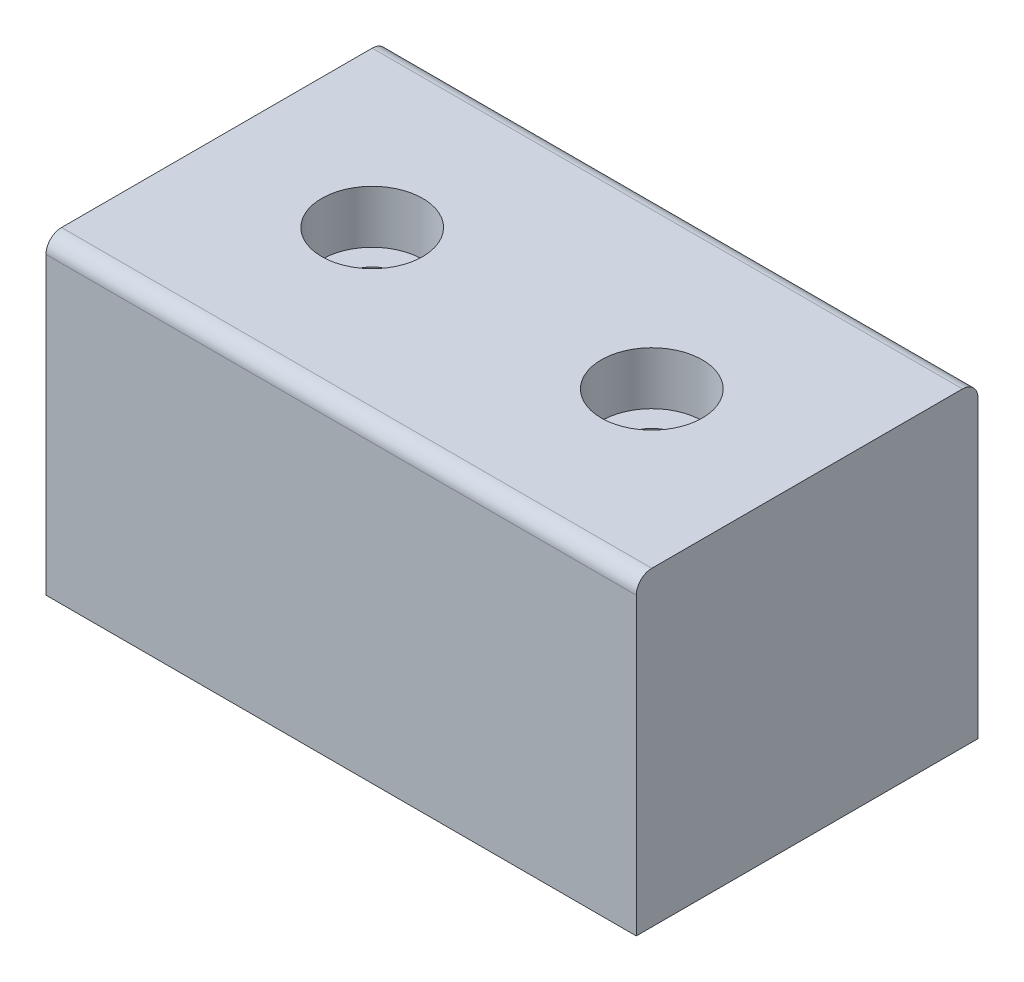
ISO-10303-21;
HEADER;
FILE_DESCRIPTION(('STEP AP214'),'2;1');
FILE_NAME('part.step','',(''),(''),'','','');
FILE_SCHEMA(('AUTOMOTIVE_DESIGN { 1 0 10303 214 1 1 1 1 }'));
ENDSEC;
DATA;
#1=APPLICATION_CONTEXT('core data for automotive mechanical design processes');
#2=APPLICATION_PROTOCOL_DEFINITION('international standard','automotive_design',2000,#1);
#3=PRODUCT_CONTEXT('',#1,'mechanical');
#4=PRODUCT('Part','Part','',(#3));
#5=PRODUCT_RELATED_PRODUCT_CATEGORY('part','',(#4));
#6=PRODUCT_DEFINITION_FORMATION('','',#4);
#7=PRODUCT_DEFINITION_CONTEXT('part definition',#1,'design');
#8=PRODUCT_DEFINITION('design','',#6,#7);
#9=PRODUCT_DEFINITION_SHAPE('','',#8);
#10=(LENGTH_UNIT() NAMED_UNIT(*) SI_UNIT(.MILLI.,.METRE.));
#11=(NAMED_UNIT(*) PLANE_ANGLE_UNIT() SI_UNIT($,.RADIAN.));
#12=(NAMED_UNIT(*) SI_UNIT($,.STERADIAN.) SOLID_ANGLE_UNIT());
#13=UNCERTAINTY_MEASURE_WITH_UNIT(LENGTH_MEASURE(1.E-05),#10,'distance_accuracy_value','');
#14=(GEOMETRIC_REPRESENTATION_CONTEXT(3) GLOBAL_UNCERTAINTY_ASSIGNED_CONTEXT((#13)) GLOBAL_UNIT_ASSIGNED_CONTEXT((#10,
#11,#12)) REPRESENTATION_CONTEXT('',''));
#15=CARTESIAN_POINT('',(0.,0.,0.));
#16=DIRECTION('',(0.,0.,1.));
#17=DIRECTION('',(1.,0.,0.));
#18=AXIS2_PLACEMENT_3D('',#15,#16,#17);
#19=CARTESIAN_POINT('',(-19.,20.,-11.));
#20=DIRECTION('',(1.,0.,0.));
#21=DIRECTION('',(0.,0.,-1.));
#22=AXIS2_PLACEMENT_3D('',#19,#20,#21);
#23=PLANE('',#22);
#24=DIRECTION('',(0.,0.,1.));
#25=VECTOR('',#24,1.);
#26=CARTESIAN_POINT('',(-19.,20.,-11.));
#27=LINE('',#26,#25);
#28=CARTESIAN_POINT('',(-19.,20.,-10.));
#29=VERTEX_POINT('',#28);
#30=CARTESIAN_POINT('',(-19.,20.,10.));
#31=VERTEX_POINT('',#30);
#32=EDGE_CURVE('E121',#29,#31,#27,.T.);
#33=ORIENTED_EDGE('',*,*,#32,.F.);
#34=CARTESIAN_POINT('',(-19.,19.,-10.));
#35=DIRECTION('',(1.,0.,0.));
#36=DIRECTION('',(0.,0.,-1.));
#37=AXIS2_PLACEMENT_3D('',#34,#35,#36);
#38=CIRCLE('',#37,1.);
#39=CARTESIAN_POINT('',(-19.,19.,-11.));
#40=VERTEX_POINT('',#39);
#41=EDGE_CURVE('E133',#29,#40,#38,.F.);
#42=ORIENTED_EDGE('',*,*,#41,.T.);
#43=DIRECTION('',(0.,-1.,0.));
#44=VECTOR('',#43,1.);
#45=CARTESIAN_POINT('',(-19.,20.,-11.));
#46=LINE('',#45,#44);
#47=CARTESIAN_POINT('',(-19.,0.,-11.));
#48=VERTEX_POINT('',#47);
#49=EDGE_CURVE('E107',#40,#48,#46,.T.);
#50=ORIENTED_EDGE('',*,*,#49,.T.);
#51=DIRECTION('',(0.,0.,1.));
#52=VECTOR('',#51,1.);
#53=CARTESIAN_POINT('',(-19.,0.,-11.));
#54=LINE('',#53,#52);
#55=CARTESIAN_POINT('',(-19.,0.,11.));
#56=VERTEX_POINT('',#55);
#57=EDGE_CURVE('E102',#48,#56,#54,.T.);
#58=ORIENTED_EDGE('',*,*,#57,.T.);
#59=DIRECTION('',(0.,-1.,0.));
#60=VECTOR('',#59,1.);
#61=CARTESIAN_POINT('',(-19.,20.,11.));
#62=LINE('',#61,#60);
#63=CARTESIAN_POINT('',(-19.,19.,11.));
#64=VERTEX_POINT('',#63);
#65=EDGE_CURVE('E86',#64,#56,#62,.T.);
#66=ORIENTED_EDGE('',*,*,#65,.F.);
#67=CARTESIAN_POINT('',(-19.,19.,10.));
#68=DIRECTION('',(1.,0.,0.));
#69=DIRECTION('',(0.,0.,-1.));
#70=AXIS2_PLACEMENT_3D('',#67,#68,#69);
#71=CIRCLE('',#70,1.);
#72=EDGE_CURVE('E131',#64,#31,#71,.F.);
#73=ORIENTED_EDGE('',*,*,#72,.T.);
#74=EDGE_LOOP('',(#33,#42,#50,#58,#66,#73));
#75=FACE_BOUND('',#74,.T.);
#76=ADVANCED_FACE('F33',(#75),#23,.F.);
#77=CARTESIAN_POINT('',(-19.,20.,11.));
#78=DIRECTION('',(0.,0.,-1.));
#79=DIRECTION('',(-1.,0.,0.));
#80=AXIS2_PLACEMENT_3D('',#77,#78,#79);
#81=PLANE('',#80);
#82=DIRECTION('',(0.,-1.,0.));
#83=VECTOR('',#82,1.);
#84=CARTESIAN_POINT('',(19.,20.,11.));
#85=LINE('',#84,#83);
#86=CARTESIAN_POINT('',(19.,19.,11.));
#87=VERTEX_POINT('',#86);
#88=CARTESIAN_POINT('',(19.,0.,11.));
#89=VERTEX_POINT('',#88);
#90=EDGE_CURVE('E96',#87,#89,#85,.T.);
#91=ORIENTED_EDGE('',*,*,#90,.F.);
#92=DIRECTION('',(1.,0.,0.));
#93=VECTOR('',#92,1.);
#94=CARTESIAN_POINT('',(-19.,19.,11.));
#95=LINE('',#94,#93);
#96=EDGE_CURVE('E11',#87,#64,#95,.F.);
#97=ORIENTED_EDGE('',*,*,#96,.T.);
#98=ORIENTED_EDGE('',*,*,#65,.T.);
#99=DIRECTION('',(1.,0.,0.));
#100=VECTOR('',#99,1.);
#101=CARTESIAN_POINT('',(-19.,0.,11.));
#102=LINE('',#101,#100);
#103=EDGE_CURVE('E89',#56,#89,#102,.T.);
#104=ORIENTED_EDGE('',*,*,#103,.T.);
#105=EDGE_LOOP('',(#91,#97,#98,#104));
#106=FACE_BOUND('',#105,.T.);
#107=ADVANCED_FACE('F88',(#106),#81,.F.);
#108=CARTESIAN_POINT('',(19.,20.,-11.));
#109=DIRECTION('',(-1.,0.,0.));
#110=DIRECTION('',(0.,0.,1.));
#111=AXIS2_PLACEMENT_3D('',#108,#109,#110);
#112=PLANE('',#111);
#113=DIRECTION('',(0.,-1.,0.));
#114=VECTOR('',#113,1.);
#115=CARTESIAN_POINT('',(19.,20.,-11.));
#116=LINE('',#115,#114);
#117=CARTESIAN_POINT('',(19.,19.,-11.));
#118=VERTEX_POINT('',#117);
#119=CARTESIAN_POINT('',(19.,0.,-11.));
#120=VERTEX_POINT('',#119);
#121=EDGE_CURVE('E123',#118,#120,#116,.T.);
#122=ORIENTED_EDGE('',*,*,#121,.F.);
#123=CARTESIAN_POINT('',(19.,19.,-10.));
#124=DIRECTION('',(-1.,0.,0.));
#125=DIRECTION('',(0.,0.,1.));
#126=AXIS2_PLACEMENT_3D('',#123,#124,#125);
#127=CIRCLE('',#126,1.);
#128=CARTESIAN_POINT('',(19.,20.,-10.));
#129=VERTEX_POINT('',#128);
#130=EDGE_CURVE('E41',#118,#129,#127,.F.);
#131=ORIENTED_EDGE('',*,*,#130,.T.);
#132=DIRECTION('',(0.,0.,-1.));
#133=VECTOR('',#132,1.);
#134=CARTESIAN_POINT('',(19.,20.,-11.));
#135=LINE('',#134,#133);
#136=CARTESIAN_POINT('',(19.,20.,10.));
#137=VERTEX_POINT('',#136);
#138=EDGE_CURVE('E115',#137,#129,#135,.T.);
#139=ORIENTED_EDGE('',*,*,#138,.F.);
#140=CARTESIAN_POINT('',(19.,19.,10.));
#141=DIRECTION('',(-1.,0.,0.));
#142=DIRECTION('',(0.,0.,1.));
#143=AXIS2_PLACEMENT_3D('',#140,#141,#142);
#144=CIRCLE('',#143,1.);
#145=EDGE_CURVE('E48',#137,#87,#144,.F.);
#146=ORIENTED_EDGE('',*,*,#145,.T.);
#147=ORIENTED_EDGE('',*,*,#90,.T.);
#148=DIRECTION('',(0.,0.,-1.));
#149=VECTOR('',#148,1.);
#150=CARTESIAN_POINT('',(19.,0.,-11.));
#151=LINE('',#150,#149);
#152=EDGE_CURVE('E104',#89,#120,#151,.T.);
#153=ORIENTED_EDGE('',*,*,#152,.T.);
#154=EDGE_LOOP('',(#122,#131,#139,#146,#147,#153));
#155=FACE_BOUND('',#154,.T.);
#156=ADVANCED_FACE('F138',(#155),#112,.F.);
#157=CARTESIAN_POINT('',(-19.,20.,-11.));
#158=DIRECTION('',(0.,0.,1.));
#159=DIRECTION('',(1.,0.,0.));
#160=AXIS2_PLACEMENT_3D('',#157,#158,#159);
#161=PLANE('',#160);
#162=ORIENTED_EDGE('',*,*,#49,.F.);
#163=DIRECTION('',(-1.,0.,0.));
#164=VECTOR('',#163,1.);
#165=CARTESIAN_POINT('',(19.,19.,-11.));
#166=LINE('',#165,#164);
#167=EDGE_CURVE('E56',#40,#118,#166,.F.);
#168=ORIENTED_EDGE('',*,*,#167,.T.);
#169=ORIENTED_EDGE('',*,*,#121,.T.);
#170=DIRECTION('',(-1.,0.,0.));
#171=VECTOR('',#170,1.);
#172=CARTESIAN_POINT('',(-19.,0.,-11.));
#173=LINE('',#172,#171);
#174=EDGE_CURVE('E119',#120,#48,#173,.T.);
#175=ORIENTED_EDGE('',*,*,#174,.T.);
#176=EDGE_LOOP('',(#162,#168,#169,#175));
#177=FACE_BOUND('',#176,.T.);
#178=ADVANCED_FACE('F146',(#177),#161,.F.);
#179=CARTESIAN_POINT('',(0.,20.,0.));
#180=DIRECTION('',(0.,1.,0.));
#181=DIRECTION('',(0.,0.,1.));
#182=AXIS2_PLACEMENT_3D('',#179,#180,#181);
#183=PLANE('',#182);
#184=CARTESIAN_POINT('',(-9.,20.,0.));
#185=DIRECTION('',(0.,1.,0.));
#186=DIRECTION('',(0.,0.,1.));
#187=AXIS2_PLACEMENT_3D('',#184,#185,#186);
#188=CIRCLE('',#187,3.25);
#189=CARTESIAN_POINT('',(-9.,20.,3.25));
#190=VERTEX_POINT('',#189);
#191=EDGE_CURVE('E166',#190,#190,#188,.T.);
#192=ORIENTED_EDGE('',*,*,#191,.F.);
#193=EDGE_LOOP('',(#192));
#194=FACE_BOUND('',#193,.T.);
#195=CARTESIAN_POINT('',(9.,20.,0.));
#196=DIRECTION('',(0.,1.,0.));
#197=DIRECTION('',(0.,0.,1.));
#198=AXIS2_PLACEMENT_3D('',#195,#196,#197);
#199=CIRCLE('',#198,3.25);
#200=CARTESIAN_POINT('',(9.,20.,3.25));
#201=VERTEX_POINT('',#200);
#202=EDGE_CURVE('E154',#201,#201,#199,.T.);
#203=ORIENTED_EDGE('',*,*,#202,.F.);
#204=EDGE_LOOP('',(#203));
#205=FACE_BOUND('',#204,.T.);
#206=ORIENTED_EDGE('',*,*,#138,.T.);
#207=DIRECTION('',(-1.,0.,0.));
#208=VECTOR('',#207,1.);
#209=CARTESIAN_POINT('',(-19.,20.,-10.));
#210=LINE('',#209,#208);
#211=EDGE_CURVE('E128',#129,#29,#210,.T.);
#212=ORIENTED_EDGE('',*,*,#211,.T.);
#213=ORIENTED_EDGE('',*,*,#32,.T.);
#214=DIRECTION('',(1.,0.,0.));
#215=VECTOR('',#214,1.);
#216=CARTESIAN_POINT('',(19.,20.,10.));
#217=LINE('',#216,#215);
#218=EDGE_CURVE('E95',#31,#137,#217,.T.);
#219=ORIENTED_EDGE('',*,*,#218,.T.);
#220=EDGE_LOOP('',(#206,#212,#213,#219));
#221=FACE_BOUND('',#220,.T.);
#222=ADVANCED_FACE('F142',(#194,#205,#221),#183,.T.);
#223=CARTESIAN_POINT('',(0.,0.,0.));
#224=DIRECTION('',(0.,1.,0.));
#225=DIRECTION('',(0.,0.,1.));
#226=AXIS2_PLACEMENT_3D('',#223,#224,#225);
#227=PLANE('',#226);
#228=CARTESIAN_POINT('',(-9.,0.,0.));
#229=DIRECTION('',(0.,1.,0.));
#230=DIRECTION('',(0.,0.,1.));
#231=AXIS2_PLACEMENT_3D('',#228,#229,#230);
#232=CIRCLE('',#231,1.69999999999999);
#233=CARTESIAN_POINT('',(-9.,0.,1.69999999999999));
#234=VERTEX_POINT('',#233);
#235=EDGE_CURVE('E157',#234,#234,#232,.T.);
#236=ORIENTED_EDGE('',*,*,#235,.T.);
#237=EDGE_LOOP('',(#236));
#238=FACE_BOUND('',#237,.T.);
#239=CARTESIAN_POINT('',(9.,0.,0.));
#240=DIRECTION('',(0.,1.,0.));
#241=DIRECTION('',(0.,0.,1.));
#242=AXIS2_PLACEMENT_3D('',#239,#240,#241);
#243=CIRCLE('',#242,1.69999999999999);
#244=CARTESIAN_POINT('',(9.,0.,1.69999999999999));
#245=VERTEX_POINT('',#244);
#246=EDGE_CURVE('E109',#245,#245,#243,.T.);
#247=ORIENTED_EDGE('',*,*,#246,.T.);
#248=EDGE_LOOP('',(#247));
#249=FACE_BOUND('',#248,.T.);
#250=ORIENTED_EDGE('',*,*,#57,.F.);
#251=ORIENTED_EDGE('',*,*,#174,.F.);
#252=ORIENTED_EDGE('',*,*,#152,.F.);
#253=ORIENTED_EDGE('',*,*,#103,.F.);
#254=EDGE_LOOP('',(#250,#251,#252,#253));
#255=FACE_BOUND('',#254,.T.);
#256=ADVANCED_FACE('F100',(#238,#249,#255),#227,.F.);
#257=CARTESIAN_POINT('',(9.,20.,0.));
#258=DIRECTION('',(0.,1.,0.));
#259=DIRECTION('',(0.,0.,1.));
#260=AXIS2_PLACEMENT_3D('',#257,#258,#259);
#261=CYLINDRICAL_SURFACE('',#260,1.7);
#262=ORIENTED_EDGE('',*,*,#246,.F.);
#263=EDGE_LOOP('',(#262));
#264=FACE_BOUND('',#263,.T.);
#265=CARTESIAN_POINT('',(9.,16.6,0.));
#266=DIRECTION('',(0.,1.,0.));
#267=DIRECTION('',(0.,0.,1.));
#268=AXIS2_PLACEMENT_3D('',#265,#266,#267);
#269=CIRCLE('',#268,1.7);
#270=CARTESIAN_POINT('',(9.,16.6,1.7));
#271=VERTEX_POINT('',#270);
#272=EDGE_CURVE('E112',#271,#271,#269,.T.);
#273=ORIENTED_EDGE('',*,*,#272,.T.);
#274=EDGE_LOOP('',(#273));
#275=FACE_BOUND('',#274,.T.);
#276=ADVANCED_FACE('F190',(#264,#275),#261,.F.);
#277=CARTESIAN_POINT('',(10.7,16.6,0.));
#278=DIRECTION('',(0.,-1.,0.));
#279=DIRECTION('',(0.,0.,-1.));
#280=AXIS2_PLACEMENT_3D('',#277,#278,#279);
#281=PLANE('',#280);
#282=ORIENTED_EDGE('',*,*,#272,.F.);
#283=EDGE_LOOP('',(#282));
#284=FACE_BOUND('',#283,.T.);
#285=CARTESIAN_POINT('',(9.,16.6,0.));
#286=DIRECTION('',(0.,1.,0.));
#287=DIRECTION('',(0.,0.,1.));
#288=AXIS2_PLACEMENT_3D('',#285,#286,#287);
#289=CIRCLE('',#288,3.25);
#290=CARTESIAN_POINT('',(9.,16.6,3.25));
#291=VERTEX_POINT('',#290);
#292=EDGE_CURVE('E151',#291,#291,#289,.T.);
#293=ORIENTED_EDGE('',*,*,#292,.T.);
#294=EDGE_LOOP('',(#293));
#295=FACE_BOUND('',#294,.T.);
#296=ADVANCED_FACE('F180',(#284,#295),#281,.F.);
#297=CARTESIAN_POINT('',(9.,20.,0.));
#298=DIRECTION('',(0.,1.,0.));
#299=DIRECTION('',(0.,0.,1.));
#300=AXIS2_PLACEMENT_3D('',#297,#298,#299);
#301=CYLINDRICAL_SURFACE('',#300,3.25);
#302=ORIENTED_EDGE('',*,*,#292,.F.);
#303=EDGE_LOOP('',(#302));
#304=FACE_BOUND('',#303,.T.);
#305=ORIENTED_EDGE('',*,*,#202,.T.);
#306=EDGE_LOOP('',(#305));
#307=FACE_BOUND('',#306,.T.);
#308=ADVANCED_FACE('F177',(#304,#307),#301,.F.);
#309=CARTESIAN_POINT('',(-9.,20.,0.));
#310=DIRECTION('',(0.,1.,0.));
#311=DIRECTION('',(0.,0.,1.));
#312=AXIS2_PLACEMENT_3D('',#309,#310,#311);
#313=CYLINDRICAL_SURFACE('',#312,1.7);
#314=ORIENTED_EDGE('',*,*,#235,.F.);
#315=EDGE_LOOP('',(#314));
#316=FACE_BOUND('',#315,.T.);
#317=CARTESIAN_POINT('',(-9.,16.6,0.));
#318=DIRECTION('',(0.,1.,0.));
#319=DIRECTION('',(0.,0.,1.));
#320=AXIS2_PLACEMENT_3D('',#317,#318,#319);
#321=CIRCLE('',#320,1.7);
#322=CARTESIAN_POINT('',(-9.,16.6,1.7));
#323=VERTEX_POINT('',#322);
#324=EDGE_CURVE('E160',#323,#323,#321,.T.);
#325=ORIENTED_EDGE('',*,*,#324,.T.);
#326=EDGE_LOOP('',(#325));
#327=FACE_BOUND('',#326,.T.);
#328=ADVANCED_FACE('F179',(#316,#327),#313,.F.);
#329=CARTESIAN_POINT('',(-7.3,16.6,0.));
#330=DIRECTION('',(0.,-1.,0.));
#331=DIRECTION('',(0.,0.,-1.));
#332=AXIS2_PLACEMENT_3D('',#329,#330,#331);
#333=PLANE('',#332);
#334=ORIENTED_EDGE('',*,*,#324,.F.);
#335=EDGE_LOOP('',(#334));
#336=FACE_BOUND('',#335,.T.);
#337=CARTESIAN_POINT('',(-9.,16.6,0.));
#338=DIRECTION('',(0.,1.,0.));
#339=DIRECTION('',(0.,0.,1.));
#340=AXIS2_PLACEMENT_3D('',#337,#338,#339);
#341=CIRCLE('',#340,3.25);
#342=CARTESIAN_POINT('',(-9.,16.6,3.25));
#343=VERTEX_POINT('',#342);
#344=EDGE_CURVE('E163',#343,#343,#341,.T.);
#345=ORIENTED_EDGE('',*,*,#344,.T.);
#346=EDGE_LOOP('',(#345));
#347=FACE_BOUND('',#346,.T.);
#348=ADVANCED_FACE('F187',(#336,#347),#333,.F.);
#349=CARTESIAN_POINT('',(-9.,20.,0.));
#350=DIRECTION('',(0.,1.,0.));
#351=DIRECTION('',(0.,0.,1.));
#352=AXIS2_PLACEMENT_3D('',#349,#350,#351);
#353=CYLINDRICAL_SURFACE('',#352,3.25);
#354=ORIENTED_EDGE('',*,*,#344,.F.);
#355=EDGE_LOOP('',(#354));
#356=FACE_BOUND('',#355,.T.);
#357=ORIENTED_EDGE('',*,*,#191,.T.);
#358=EDGE_LOOP('',(#357));
#359=FACE_BOUND('',#358,.T.);
#360=ADVANCED_FACE('F170',(#356,#359),#353,.F.);
#361=CARTESIAN_POINT('',(0.,19.,-10.));
#362=DIRECTION('',(1.,0.,0.));
#363=DIRECTION('',(0.,0.,-1.));
#364=AXIS2_PLACEMENT_3D('',#361,#362,#363);
#365=CYLINDRICAL_SURFACE('',#364,1.);
#366=ORIENTED_EDGE('',*,*,#130,.F.);
#367=ORIENTED_EDGE('',*,*,#167,.F.);
#368=ORIENTED_EDGE('',*,*,#41,.F.);
#369=ORIENTED_EDGE('',*,*,#211,.F.);
#370=EDGE_LOOP('',(#366,#367,#368,#369));
#371=FACE_BOUND('',#370,.T.);
#372=ADVANCED_FACE('F145',(#371),#365,.T.);
#373=CARTESIAN_POINT('',(0.,19.,10.));
#374=DIRECTION('',(-1.,0.,0.));
#375=DIRECTION('',(0.,0.,1.));
#376=AXIS2_PLACEMENT_3D('',#373,#374,#375);
#377=CYLINDRICAL_SURFACE('',#376,1.);
#378=ORIENTED_EDGE('',*,*,#72,.F.);
#379=ORIENTED_EDGE('',*,*,#96,.F.);
#380=ORIENTED_EDGE('',*,*,#145,.F.);
#381=ORIENTED_EDGE('',*,*,#218,.F.);
#382=EDGE_LOOP('',(#378,#379,#380,#381));
#383=FACE_BOUND('',#382,.T.);
#384=ADVANCED_FACE('F35',(#383),#377,.T.);
#385=CLOSED_SHELL('',(#76,#107,#156,#178,#222,#256,#276,#296,#308,#328,#348,#360,#372,#384));
#386=MANIFOLD_SOLID_BREP('B2',#385);
#387=ADVANCED_BREP_SHAPE_REPRESENTATION('',(#18,#386),#14);
#388=SHAPE_DEFINITION_REPRESENTATION(#9,#387);
ENDSEC;
END-ISO-10303-21;
